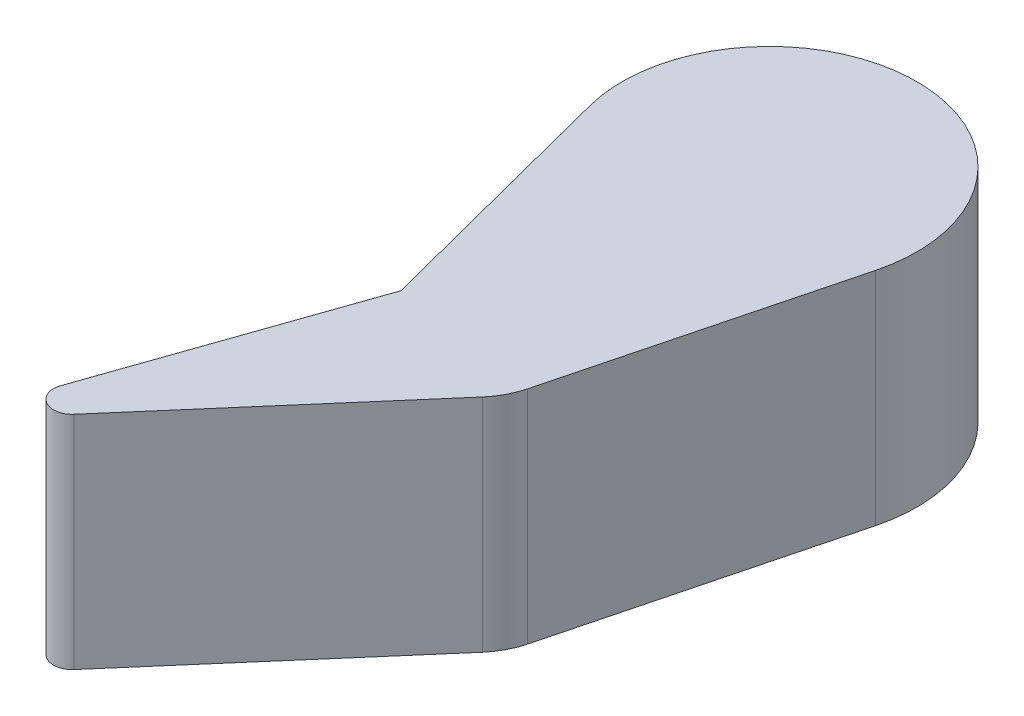
ISO-10303-21;
HEADER;
FILE_DESCRIPTION(('STEP AP214'),'2;1');
FILE_NAME('part.step','',(''),(''),'','','');
FILE_SCHEMA(('AUTOMOTIVE_DESIGN { 1 0 10303 214 1 1 1 1 }'));
ENDSEC;
DATA;
#1=APPLICATION_CONTEXT('core data for automotive mechanical design processes');
#2=APPLICATION_PROTOCOL_DEFINITION('international standard','automotive_design',2000,#1);
#3=PRODUCT_CONTEXT('',#1,'mechanical');
#4=PRODUCT('Part','Part','',(#3));
#5=PRODUCT_RELATED_PRODUCT_CATEGORY('part','',(#4));
#6=PRODUCT_DEFINITION_FORMATION('','',#4);
#7=PRODUCT_DEFINITION_CONTEXT('part definition',#1,'design');
#8=PRODUCT_DEFINITION('design','',#6,#7);
#9=PRODUCT_DEFINITION_SHAPE('','',#8);
#10=(LENGTH_UNIT() NAMED_UNIT(*) SI_UNIT(.MILLI.,.METRE.));
#11=(NAMED_UNIT(*) PLANE_ANGLE_UNIT() SI_UNIT($,.RADIAN.));
#12=(NAMED_UNIT(*) SI_UNIT($,.STERADIAN.) SOLID_ANGLE_UNIT());
#13=UNCERTAINTY_MEASURE_WITH_UNIT(LENGTH_MEASURE(1.E-05),#10,'distance_accuracy_value','');
#14=(GEOMETRIC_REPRESENTATION_CONTEXT(3) GLOBAL_UNCERTAINTY_ASSIGNED_CONTEXT((#13)) GLOBAL_UNIT_ASSIGNED_CONTEXT((#10,
#11,#12)) REPRESENTATION_CONTEXT('',''));
#15=CARTESIAN_POINT('',(0.,0.,0.));
#16=DIRECTION('',(0.,0.,1.));
#17=DIRECTION('',(1.,0.,0.));
#18=AXIS2_PLACEMENT_3D('',#15,#16,#17);
#19=CARTESIAN_POINT('',(-20.8778671572562,60.,79.1403681956159));
#20=DIRECTION('',(0.944416099301012,0.,0.328752538212347));
#21=DIRECTION('',(0.328752538212347,0.,-0.944416099301012));
#22=AXIS2_PLACEMENT_3D('',#19,#20,#21);
#23=PLANE('',#22);
#24=DIRECTION('',(-0.328752538212347,0.,0.944416099301012));
#25=VECTOR('',#24,1.);
#26=CARTESIAN_POINT('',(-20.8778671572562,0.,79.1403681956159));
#27=LINE('',#26,#25);
#28=CARTESIAN_POINT('',(-20.8778671572562,0.,79.1403681956159));
#29=VERTEX_POINT('',#28);
#30=CARTESIAN_POINT('',(-44.7220804965051,0.,147.638269611693));
#31=VERTEX_POINT('',#30);
#32=EDGE_CURVE('E127',#29,#31,#27,.T.);
#33=ORIENTED_EDGE('',*,*,#32,.T.);
#34=DIRECTION('',(0.,-1.,0.));
#35=VECTOR('',#34,1.);
#36=CARTESIAN_POINT('',(-44.7220804965051,60.,147.638269611693));
#37=LINE('',#36,#35);
#38=CARTESIAN_POINT('',(-44.7220804965051,60.,147.638269611693));
#39=VERTEX_POINT('',#38);
#40=EDGE_CURVE('E11',#39,#31,#37,.T.);
#41=ORIENTED_EDGE('',*,*,#40,.F.);
#42=DIRECTION('',(-0.328752538212347,0.,0.944416099301012));
#43=VECTOR('',#42,1.);
#44=CARTESIAN_POINT('',(-20.8778671572562,60.,79.1403681956159));
#45=LINE('',#44,#43);
#46=CARTESIAN_POINT('',(-20.8778671572562,60.,79.1403681956159));
#47=VERTEX_POINT('',#46);
#48=EDGE_CURVE('E139',#47,#39,#45,.T.);
#49=ORIENTED_EDGE('',*,*,#48,.F.);
#50=DIRECTION('',(0.,-1.,0.));
#51=VECTOR('',#50,1.);
#52=CARTESIAN_POINT('',(-20.8778671572562,60.,79.1403681956159));
#53=LINE('',#52,#51);
#54=EDGE_CURVE('E123',#47,#29,#53,.T.);
#55=ORIENTED_EDGE('',*,*,#54,.T.);
#56=EDGE_LOOP('',(#33,#41,#49,#55));
#57=FACE_BOUND('',#56,.T.);
#58=ADVANCED_FACE('F37',(#57),#23,.F.);
#59=CARTESIAN_POINT('',(-40.,60.,149.282032302755));
#60=DIRECTION('',(0.,-1.,0.));
#61=DIRECTION('',(0.,0.,-1.));
#62=AXIS2_PLACEMENT_3D('',#59,#60,#61);
#63=CYLINDRICAL_SURFACE('',#62,5.);
#64=CARTESIAN_POINT('',(-40.,0.,149.282032302755));
#65=DIRECTION('',(0.,1.,0.));
#66=DIRECTION('',(0.,0.,1.));
#67=AXIS2_PLACEMENT_3D('',#64,#65,#66);
#68=CIRCLE('',#67,5.);
#69=CARTESIAN_POINT('',(-36.215419503495,0.,152.549592625913));
#70=VERTEX_POINT('',#69);
#71=EDGE_CURVE('E130',#31,#70,#68,.T.);
#72=ORIENTED_EDGE('',*,*,#71,.T.);
#73=DIRECTION('',(0.,-1.,0.));
#74=VECTOR('',#73,1.);
#75=CARTESIAN_POINT('',(-36.215419503495,60.,152.549592625913));
#76=LINE('',#75,#74);
#77=CARTESIAN_POINT('',(-36.215419503495,60.,152.549592625913));
#78=VERTEX_POINT('',#77);
#79=EDGE_CURVE('E45',#78,#70,#76,.T.);
#80=ORIENTED_EDGE('',*,*,#79,.F.);
#81=CARTESIAN_POINT('',(-40.,60.,149.282032302755));
#82=DIRECTION('',(0.,1.,0.));
#83=DIRECTION('',(0.,0.,1.));
#84=AXIS2_PLACEMENT_3D('',#81,#82,#83);
#85=CIRCLE('',#84,5.);
#86=EDGE_CURVE('E93',#39,#78,#85,.T.);
#87=ORIENTED_EDGE('',*,*,#86,.F.);
#88=ORIENTED_EDGE('',*,*,#40,.T.);
#89=EDGE_LOOP('',(#72,#80,#87,#88));
#90=FACE_BOUND('',#89,.T.);
#91=ADVANCED_FACE('F164',(#90),#63,.T.);
#92=CARTESIAN_POINT('',(15.1383219860202,60.,93.0702412926302));
#93=DIRECTION('',(-0.756916099301012,0.,-0.653512064631511));
#94=DIRECTION('',(-0.653512064631511,0.,0.756916099301012));
#95=AXIS2_PLACEMENT_3D('',#92,#93,#94);
#96=PLANE('',#95);
#97=DIRECTION('',(0.653512064631511,0.,-0.756916099301012));
#98=VECTOR('',#97,1.);
#99=CARTESIAN_POINT('',(15.1383219860202,0.,93.0702412926302));
#100=LINE('',#99,#98);
#101=CARTESIAN_POINT('',(15.1383219860202,0.,93.0702412926302));
#102=VERTEX_POINT('',#101);
#103=EDGE_CURVE('E132',#70,#102,#100,.T.);
#104=ORIENTED_EDGE('',*,*,#103,.T.);
#105=DIRECTION('',(0.,-1.,0.));
#106=VECTOR('',#105,1.);
#107=CARTESIAN_POINT('',(15.1383219860202,60.,93.0702412926302));
#108=LINE('',#107,#106);
#109=CARTESIAN_POINT('',(15.1383219860202,60.,93.0702412926302));
#110=VERTEX_POINT('',#109);
#111=EDGE_CURVE('E143',#110,#102,#108,.T.);
#112=ORIENTED_EDGE('',*,*,#111,.F.);
#113=DIRECTION('',(0.653512064631511,0.,-0.756916099301012));
#114=VECTOR('',#113,1.);
#115=CARTESIAN_POINT('',(15.1383219860202,60.,93.0702412926302));
#116=LINE('',#115,#114);
#117=EDGE_CURVE('E151',#78,#110,#116,.T.);
#118=ORIENTED_EDGE('',*,*,#117,.F.);
#119=ORIENTED_EDGE('',*,*,#79,.T.);
#120=EDGE_LOOP('',(#104,#112,#118,#119));
#121=FACE_BOUND('',#120,.T.);
#122=ADVANCED_FACE('F149',(#121),#96,.F.);
#123=CARTESIAN_POINT('',(0.,60.,80.));
#124=DIRECTION('',(0.,-1.,0.));
#125=DIRECTION('',(0.,0.,-1.));
#126=AXIS2_PLACEMENT_3D('',#123,#124,#125);
#127=CYLINDRICAL_SURFACE('',#126,20.);
#128=CARTESIAN_POINT('',(0.,0.,80.));
#129=DIRECTION('',(0.,1.,0.));
#130=DIRECTION('',(0.,0.,1.));
#131=AXIS2_PLACEMENT_3D('',#128,#129,#130);
#132=CIRCLE('',#131,20.);
#133=CARTESIAN_POINT('',(19.3649167310371,0.,85.));
#134=VERTEX_POINT('',#133);
#135=EDGE_CURVE('E134',#102,#134,#132,.T.);
#136=ORIENTED_EDGE('',*,*,#135,.T.);
#137=DIRECTION('',(0.,-1.,0.));
#138=VECTOR('',#137,1.);
#139=CARTESIAN_POINT('',(19.3649167310371,60.,85.));
#140=LINE('',#139,#138);
#141=CARTESIAN_POINT('',(19.3649167310371,60.,85.));
#142=VERTEX_POINT('',#141);
#143=EDGE_CURVE('E118',#142,#134,#140,.T.);
#144=ORIENTED_EDGE('',*,*,#143,.F.);
#145=CARTESIAN_POINT('',(0.,60.,80.));
#146=DIRECTION('',(0.,1.,0.));
#147=DIRECTION('',(0.,0.,1.));
#148=AXIS2_PLACEMENT_3D('',#145,#146,#147);
#149=CIRCLE('',#148,20.);
#150=EDGE_CURVE('E109',#110,#142,#149,.T.);
#151=ORIENTED_EDGE('',*,*,#150,.F.);
#152=ORIENTED_EDGE('',*,*,#111,.T.);
#153=EDGE_LOOP('',(#136,#144,#151,#152));
#154=FACE_BOUND('',#153,.T.);
#155=ADVANCED_FACE('F157',(#154),#127,.T.);
#156=CARTESIAN_POINT('',(38.7298334620742,60.,9.99999999999999));
#157=DIRECTION('',(-0.968245836551854,0.,-0.25));
#158=DIRECTION('',(-0.25,0.,0.968245836551854));
#159=AXIS2_PLACEMENT_3D('',#156,#157,#158);
#160=PLANE('',#159);
#161=DIRECTION('',(0.25,0.,-0.968245836551854));
#162=VECTOR('',#161,1.);
#163=CARTESIAN_POINT('',(38.7298334620742,0.,9.99999999999999));
#164=LINE('',#163,#162);
#165=CARTESIAN_POINT('',(38.7298334620742,0.,9.99999999999999));
#166=VERTEX_POINT('',#165);
#167=EDGE_CURVE('E117',#134,#166,#164,.T.);
#168=ORIENTED_EDGE('',*,*,#167,.T.);
#169=DIRECTION('',(0.,-1.,0.));
#170=VECTOR('',#169,1.);
#171=CARTESIAN_POINT('',(38.7298334620742,60.,9.99999999999999));
#172=LINE('',#171,#170);
#173=CARTESIAN_POINT('',(38.7298334620742,60.,9.99999999999999));
#174=VERTEX_POINT('',#173);
#175=EDGE_CURVE('E114',#174,#166,#172,.T.);
#176=ORIENTED_EDGE('',*,*,#175,.F.);
#177=DIRECTION('',(0.25,0.,-0.968245836551854));
#178=VECTOR('',#177,1.);
#179=CARTESIAN_POINT('',(38.7298334620742,60.,9.99999999999999));
#180=LINE('',#179,#178);
#181=EDGE_CURVE('E103',#142,#174,#180,.T.);
#182=ORIENTED_EDGE('',*,*,#181,.F.);
#183=ORIENTED_EDGE('',*,*,#143,.T.);
#184=EDGE_LOOP('',(#168,#176,#182,#183));
#185=FACE_BOUND('',#184,.T.);
#186=ADVANCED_FACE('F115',(#185),#160,.F.);
#187=CARTESIAN_POINT('',(0.,60.,0.));
#188=DIRECTION('',(0.,-1.,0.));
#189=DIRECTION('',(0.,0.,-1.));
#190=AXIS2_PLACEMENT_3D('',#187,#188,#189);
#191=CYLINDRICAL_SURFACE('',#190,40.);
#192=CARTESIAN_POINT('',(0.,0.,0.));
#193=DIRECTION('',(0.,1.,0.));
#194=DIRECTION('',(0.,0.,1.));
#195=AXIS2_PLACEMENT_3D('',#192,#193,#194);
#196=CIRCLE('',#195,40.);
#197=CARTESIAN_POINT('',(-38.7298334620742,0.,10.));
#198=VERTEX_POINT('',#197);
#199=EDGE_CURVE('E79',#166,#198,#196,.T.);
#200=ORIENTED_EDGE('',*,*,#199,.T.);
#201=DIRECTION('',(0.,-1.,0.));
#202=VECTOR('',#201,1.);
#203=CARTESIAN_POINT('',(-38.7298334620742,60.,10.));
#204=LINE('',#203,#202);
#205=CARTESIAN_POINT('',(-38.7298334620742,60.,10.));
#206=VERTEX_POINT('',#205);
#207=EDGE_CURVE('E119',#206,#198,#204,.T.);
#208=ORIENTED_EDGE('',*,*,#207,.F.);
#209=CARTESIAN_POINT('',(0.,60.,0.));
#210=DIRECTION('',(0.,1.,0.));
#211=DIRECTION('',(0.,0.,1.));
#212=AXIS2_PLACEMENT_3D('',#209,#210,#211);
#213=CIRCLE('',#212,40.);
#214=EDGE_CURVE('E107',#174,#206,#213,.T.);
#215=ORIENTED_EDGE('',*,*,#214,.F.);
#216=ORIENTED_EDGE('',*,*,#175,.T.);
#217=EDGE_LOOP('',(#200,#208,#215,#216));
#218=FACE_BOUND('',#217,.T.);
#219=ADVANCED_FACE('F121',(#218),#191,.T.);
#220=CARTESIAN_POINT('',(-38.7298334620742,60.,10.));
#221=DIRECTION('',(0.968245836551854,0.,-0.25));
#222=DIRECTION('',(-0.25,0.,-0.968245836551854));
#223=AXIS2_PLACEMENT_3D('',#220,#221,#222);
#224=PLANE('',#223);
#225=DIRECTION('',(0.25,0.,0.968245836551854));
#226=VECTOR('',#225,1.);
#227=CARTESIAN_POINT('',(-38.7298334620742,0.,10.));
#228=LINE('',#227,#226);
#229=EDGE_CURVE('E85',#198,#29,#228,.T.);
#230=ORIENTED_EDGE('',*,*,#229,.T.);
#231=ORIENTED_EDGE('',*,*,#54,.F.);
#232=DIRECTION('',(0.25,0.,0.968245836551854));
#233=VECTOR('',#232,1.);
#234=CARTESIAN_POINT('',(-38.7298334620742,60.,10.));
#235=LINE('',#234,#233);
#236=EDGE_CURVE('E53',#206,#47,#235,.T.);
#237=ORIENTED_EDGE('',*,*,#236,.F.);
#238=ORIENTED_EDGE('',*,*,#207,.T.);
#239=EDGE_LOOP('',(#230,#231,#237,#238));
#240=FACE_BOUND('',#239,.T.);
#241=ADVANCED_FACE('F178',(#240),#224,.F.);
#242=CARTESIAN_POINT('',(-40.,60.,149.282032302755));
#243=DIRECTION('',(0.,1.,0.));
#244=DIRECTION('',(0.,0.,1.));
#245=AXIS2_PLACEMENT_3D('',#242,#243,#244);
#246=PLANE('',#245);
#247=ORIENTED_EDGE('',*,*,#48,.T.);
#248=ORIENTED_EDGE('',*,*,#86,.T.);
#249=ORIENTED_EDGE('',*,*,#117,.T.);
#250=ORIENTED_EDGE('',*,*,#150,.T.);
#251=ORIENTED_EDGE('',*,*,#181,.T.);
#252=ORIENTED_EDGE('',*,*,#214,.T.);
#253=ORIENTED_EDGE('',*,*,#236,.T.);
#254=EDGE_LOOP('',(#247,#248,#249,#250,#251,#252,#253));
#255=FACE_BOUND('',#254,.T.);
#256=ADVANCED_FACE('F105',(#255),#246,.T.);
#257=CARTESIAN_POINT('',(-40.,0.,149.282032302755));
#258=DIRECTION('',(0.,1.,0.));
#259=DIRECTION('',(0.,0.,1.));
#260=AXIS2_PLACEMENT_3D('',#257,#258,#259);
#261=PLANE('',#260);
#262=ORIENTED_EDGE('',*,*,#32,.F.);
#263=ORIENTED_EDGE('',*,*,#229,.F.);
#264=ORIENTED_EDGE('',*,*,#199,.F.);
#265=ORIENTED_EDGE('',*,*,#167,.F.);
#266=ORIENTED_EDGE('',*,*,#135,.F.);
#267=ORIENTED_EDGE('',*,*,#103,.F.);
#268=ORIENTED_EDGE('',*,*,#71,.F.);
#269=EDGE_LOOP('',(#262,#263,#264,#265,#266,#267,#268));
#270=FACE_BOUND('',#269,.T.);
#271=ADVANCED_FACE('F155',(#270),#261,.F.);
#272=CLOSED_SHELL('',(#58,#91,#122,#155,#186,#219,#241,#256,#271));
#273=MANIFOLD_SOLID_BREP('B2',#272);
#274=ADVANCED_BREP_SHAPE_REPRESENTATION('',(#18,#273),#14);
#275=SHAPE_DEFINITION_REPRESENTATION(#9,#274);
ENDSEC;
END-ISO-10303-21;
